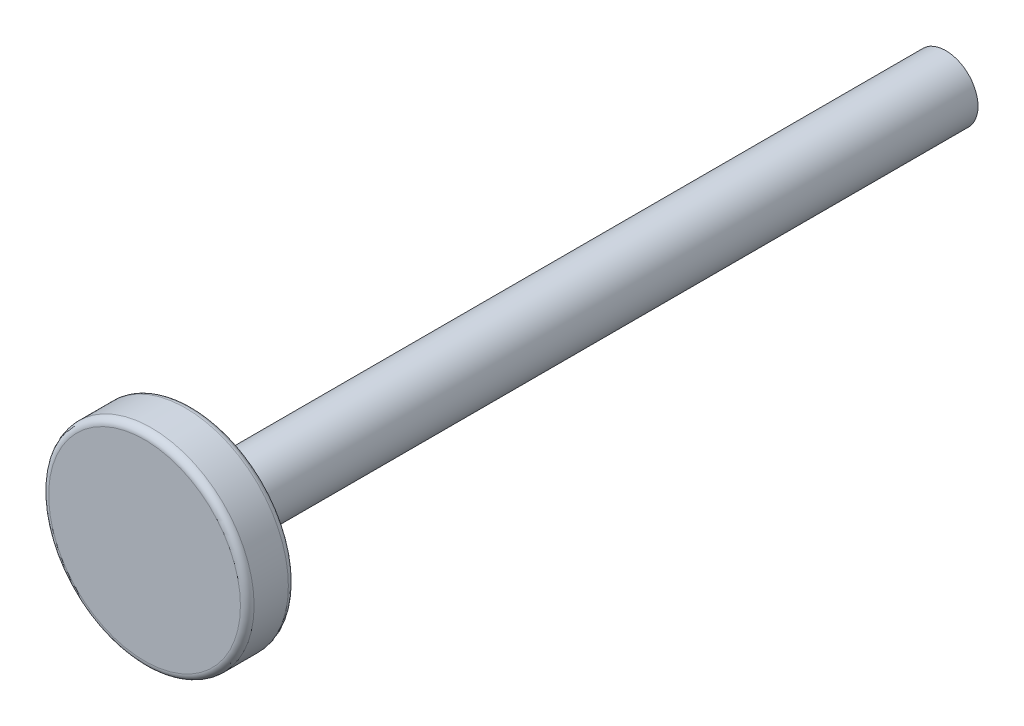
ISO-10303-21;
HEADER;
FILE_DESCRIPTION(('STEP AP214'),'2;1');
FILE_NAME('part.step','',(''),(''),'','','');
FILE_SCHEMA(('AUTOMOTIVE_DESIGN { 1 0 10303 214 1 1 1 1 }'));
ENDSEC;
DATA;
#1=APPLICATION_CONTEXT('core data for automotive mechanical design processes');
#2=APPLICATION_PROTOCOL_DEFINITION('international standard','automotive_design',2000,#1);
#3=PRODUCT_CONTEXT('',#1,'mechanical');
#4=PRODUCT('Part','Part','',(#3));
#5=PRODUCT_RELATED_PRODUCT_CATEGORY('part','',(#4));
#6=PRODUCT_DEFINITION_FORMATION('','',#4);
#7=PRODUCT_DEFINITION_CONTEXT('part definition',#1,'design');
#8=PRODUCT_DEFINITION('design','',#6,#7);
#9=PRODUCT_DEFINITION_SHAPE('','',#8);
#10=(LENGTH_UNIT() NAMED_UNIT(*) SI_UNIT(.MILLI.,.METRE.));
#11=(NAMED_UNIT(*) PLANE_ANGLE_UNIT() SI_UNIT($,.RADIAN.));
#12=(NAMED_UNIT(*) SI_UNIT($,.STERADIAN.) SOLID_ANGLE_UNIT());
#13=UNCERTAINTY_MEASURE_WITH_UNIT(LENGTH_MEASURE(1.E-05),#10,'distance_accuracy_value','');
#14=(GEOMETRIC_REPRESENTATION_CONTEXT(3) GLOBAL_UNCERTAINTY_ASSIGNED_CONTEXT((#13)) GLOBAL_UNIT_ASSIGNED_CONTEXT((#10,
#11,#12)) REPRESENTATION_CONTEXT('',''));
#15=CARTESIAN_POINT('',(0.,0.,0.));
#16=DIRECTION('',(0.,0.,1.));
#17=DIRECTION('',(1.,0.,0.));
#18=AXIS2_PLACEMENT_3D('',#15,#16,#17);
#19=CARTESIAN_POINT('',(-105.393983783825,23.9699999999999,62.4325344745578));
#20=DIRECTION('',(0.,0.,-1.));
#21=DIRECTION('',(-1.,0.,0.));
#22=AXIS2_PLACEMENT_3D('',#19,#20,#21);
#23=CYLINDRICAL_SURFACE('',#22,2.35);
#24=CARTESIAN_POINT('',(-105.393983783825,23.9699999999999,61.9325344745578));
#25=DIRECTION('',(0.,0.,1.));
#26=DIRECTION('',(1.,0.,0.));
#27=AXIS2_PLACEMENT_3D('',#24,#25,#26);
#28=CIRCLE('',#27,2.35);
#29=CARTESIAN_POINT('',(-103.043983783825,23.9699999999999,61.9325344745578));
#30=VERTEX_POINT('',#29);
#31=EDGE_CURVE('E11',#30,#30,#28,.F.);
#32=ORIENTED_EDGE('',*,*,#31,.T.);
#33=EDGE_LOOP('',(#32));
#34=FACE_BOUND('',#33,.T.);
#35=CARTESIAN_POINT('',(-105.393983783825,23.9699999999999,7.43253447455783));
#36=DIRECTION('',(0.,0.,1.));
#37=DIRECTION('',(1.,0.,0.));
#38=AXIS2_PLACEMENT_3D('',#35,#36,#37);
#39=CIRCLE('',#38,2.35);
#40=CARTESIAN_POINT('',(-103.043983783825,23.9699999999999,7.43253447455783));
#41=VERTEX_POINT('',#40);
#42=EDGE_CURVE('E66',#41,#41,#39,.T.);
#43=ORIENTED_EDGE('',*,*,#42,.T.);
#44=EDGE_LOOP('',(#43));
#45=FACE_BOUND('',#44,.T.);
#46=ADVANCED_FACE('F47',(#34,#45),#23,.T.);
#47=CARTESIAN_POINT('',(-105.393983783825,23.9699999999999,7.43253447455783));
#48=DIRECTION('',(0.,0.,1.));
#49=DIRECTION('',(1.,0.,0.));
#50=AXIS2_PLACEMENT_3D('',#47,#48,#49);
#51=PLANE('',#50);
#52=CARTESIAN_POINT('',(-105.393983783825,23.9699999999999,7.43253447455783));
#53=DIRECTION('',(0.,0.,-1.));
#54=DIRECTION('',(-1.,0.,0.));
#55=AXIS2_PLACEMENT_3D('',#52,#53,#54);
#56=CIRCLE('',#55,1.525);
#57=CARTESIAN_POINT('',(-106.918983783825,23.9699999999999,7.43253447455783));
#58=VERTEX_POINT('',#57);
#59=EDGE_CURVE('E73',#58,#58,#56,.T.);
#60=ORIENTED_EDGE('',*,*,#59,.F.);
#61=EDGE_LOOP('',(#60));
#62=FACE_BOUND('',#61,.T.);
#63=ORIENTED_EDGE('',*,*,#42,.F.);
#64=EDGE_LOOP('',(#63));
#65=FACE_BOUND('',#64,.T.);
#66=ADVANCED_FACE('F102',(#62,#65),#51,.F.);
#67=CARTESIAN_POINT('',(-105.393983783825,23.9699999999999,65.9325344745578));
#68=DIRECTION('',(0.,0.,-1.));
#69=DIRECTION('',(-1.,0.,0.));
#70=AXIS2_PLACEMENT_3D('',#67,#68,#69);
#71=CYLINDRICAL_SURFACE('',#70,7.5);
#72=CARTESIAN_POINT('',(-105.393983783825,23.9699999999999,65.4325344745578));
#73=DIRECTION('',(0.,0.,1.));
#74=DIRECTION('',(1.,0.,0.));
#75=AXIS2_PLACEMENT_3D('',#72,#73,#74);
#76=CIRCLE('',#75,7.5);
#77=CARTESIAN_POINT('',(-97.8939837838252,23.9699999999999,65.4325344745578));
#78=VERTEX_POINT('',#77);
#79=EDGE_CURVE('E82',#78,#78,#76,.F.);
#80=ORIENTED_EDGE('',*,*,#79,.T.);
#81=EDGE_LOOP('',(#80));
#82=FACE_BOUND('',#81,.T.);
#83=CARTESIAN_POINT('',(-105.393983783825,23.9699999999999,62.9325344745578));
#84=DIRECTION('',(0.,0.,1.));
#85=DIRECTION('',(1.,0.,0.));
#86=AXIS2_PLACEMENT_3D('',#83,#84,#85);
#87=CIRCLE('',#86,7.5);
#88=CARTESIAN_POINT('',(-97.8939837838252,23.9699999999999,62.9325344745578));
#89=VERTEX_POINT('',#88);
#90=EDGE_CURVE('E79',#89,#89,#87,.T.);
#91=ORIENTED_EDGE('',*,*,#90,.T.);
#92=EDGE_LOOP('',(#91));
#93=FACE_BOUND('',#92,.T.);
#94=ADVANCED_FACE('F99',(#82,#93),#71,.T.);
#95=CARTESIAN_POINT('',(-105.393983783825,23.9699999999999,65.9325344745578));
#96=DIRECTION('',(0.,0.,1.));
#97=DIRECTION('',(1.,0.,0.));
#98=AXIS2_PLACEMENT_3D('',#95,#96,#97);
#99=PLANE('',#98);
#100=CARTESIAN_POINT('',(-105.393983783825,23.9699999999999,65.9325344745578));
#101=DIRECTION('',(0.,0.,1.));
#102=DIRECTION('',(1.,0.,0.));
#103=AXIS2_PLACEMENT_3D('',#100,#101,#102);
#104=CIRCLE('',#103,7.);
#105=CARTESIAN_POINT('',(-98.3939837838252,23.9699999999999,65.9325344745578));
#106=VERTEX_POINT('',#105);
#107=EDGE_CURVE('E70',#106,#106,#104,.T.);
#108=ORIENTED_EDGE('',*,*,#107,.T.);
#109=EDGE_LOOP('',(#108));
#110=FACE_BOUND('',#109,.T.);
#111=ADVANCED_FACE('F101',(#110),#99,.T.);
#112=CARTESIAN_POINT('',(-105.393983783825,23.9699999999999,62.4325344745578));
#113=DIRECTION('',(0.,0.,1.));
#114=DIRECTION('',(1.,0.,0.));
#115=AXIS2_PLACEMENT_3D('',#112,#113,#114);
#116=PLANE('',#115);
#117=CARTESIAN_POINT('',(-105.393983783825,23.9699999999999,62.4325344745578));
#118=DIRECTION('',(0.,0.,1.));
#119=DIRECTION('',(1.,0.,0.));
#120=AXIS2_PLACEMENT_3D('',#117,#118,#119);
#121=CIRCLE('',#120,7.);
#122=CARTESIAN_POINT('',(-98.3939837838252,23.9699999999999,62.4325344745578));
#123=VERTEX_POINT('',#122);
#124=EDGE_CURVE('E54',#123,#123,#121,.F.);
#125=ORIENTED_EDGE('',*,*,#124,.T.);
#126=EDGE_LOOP('',(#125));
#127=FACE_BOUND('',#126,.T.);
#128=CARTESIAN_POINT('',(-105.393983783825,23.9699999999999,62.4325344745578));
#129=DIRECTION('',(0.,0.,1.));
#130=DIRECTION('',(1.,0.,0.));
#131=AXIS2_PLACEMENT_3D('',#128,#129,#130);
#132=CIRCLE('',#131,2.85);
#133=CARTESIAN_POINT('',(-102.543983783825,23.9699999999999,62.4325344745578));
#134=VERTEX_POINT('',#133);
#135=EDGE_CURVE('E85',#134,#134,#132,.T.);
#136=ORIENTED_EDGE('',*,*,#135,.T.);
#137=EDGE_LOOP('',(#136));
#138=FACE_BOUND('',#137,.T.);
#139=ADVANCED_FACE('F90',(#127,#138),#116,.F.);
#140=CARTESIAN_POINT('',(-105.393983783825,23.9699999999999,65.4325344745578));
#141=DIRECTION('',(0.,0.,1.));
#142=DIRECTION('',(1.,0.,0.));
#143=AXIS2_PLACEMENT_3D('',#140,#141,#142);
#144=TOROIDAL_SURFACE('',#143,7.,0.5);
#145=ORIENTED_EDGE('',*,*,#79,.F.);
#146=EDGE_LOOP('',(#145));
#147=FACE_BOUND('',#146,.T.);
#148=ORIENTED_EDGE('',*,*,#107,.F.);
#149=EDGE_LOOP('',(#148));
#150=FACE_BOUND('',#149,.T.);
#151=ADVANCED_FACE('F96',(#147,#150),#144,.T.);
#152=CARTESIAN_POINT('',(-105.393983783825,23.9699999999999,62.9325344745578));
#153=DIRECTION('',(0.,0.,1.));
#154=DIRECTION('',(1.,0.,0.));
#155=AXIS2_PLACEMENT_3D('',#152,#153,#154);
#156=TOROIDAL_SURFACE('',#155,7.,0.5);
#157=ORIENTED_EDGE('',*,*,#124,.F.);
#158=EDGE_LOOP('',(#157));
#159=FACE_BOUND('',#158,.T.);
#160=ORIENTED_EDGE('',*,*,#90,.F.);
#161=EDGE_LOOP('',(#160));
#162=FACE_BOUND('',#161,.T.);
#163=ADVANCED_FACE('F93',(#159,#162),#156,.T.);
#164=CARTESIAN_POINT('',(-105.393983783825,23.9699999999999,61.9325344745578));
#165=DIRECTION('',(0.,0.,1.));
#166=DIRECTION('',(1.,0.,0.));
#167=AXIS2_PLACEMENT_3D('',#164,#165,#166);
#168=TOROIDAL_SURFACE('',#167,2.85,0.5);
#169=ORIENTED_EDGE('',*,*,#31,.F.);
#170=EDGE_LOOP('',(#169));
#171=FACE_BOUND('',#170,.T.);
#172=ORIENTED_EDGE('',*,*,#135,.F.);
#173=EDGE_LOOP('',(#172));
#174=FACE_BOUND('',#173,.T.);
#175=ADVANCED_FACE('F49',(#171,#174),#168,.F.);
#176=CARTESIAN_POINT('',(-105.393983783825,23.9699999999999,27.4325344745578));
#177=DIRECTION('',(0.,0.,-1.));
#178=DIRECTION('',(-1.,0.,0.));
#179=AXIS2_PLACEMENT_3D('',#176,#177,#178);
#180=CONICAL_SURFACE('',#179,1.25,1.02974425867666);
#181=CARTESIAN_POINT('',(-105.393983783825,23.9699999999999,28.1836102483423));
#182=VERTEX_POINT('',#181);
#183=VERTEX_LOOP('',#182);
#184=FACE_BOUND('',#183,.T.);
#185=CARTESIAN_POINT('',(-105.393983783825,23.9699999999999,27.4325344745578));
#186=DIRECTION('',(0.,0.,-1.));
#187=DIRECTION('',(-1.,0.,0.));
#188=AXIS2_PLACEMENT_3D('',#185,#186,#187);
#189=CIRCLE('',#188,1.25);
#190=CARTESIAN_POINT('',(-106.643983783825,23.9699999999999,27.4325344745578));
#191=VERTEX_POINT('',#190);
#192=EDGE_CURVE('E64',#191,#191,#189,.T.);
#193=ORIENTED_EDGE('',*,*,#192,.T.);
#194=EDGE_LOOP('',(#193));
#195=FACE_BOUND('',#194,.T.);
#196=ADVANCED_FACE('F57',(#184,#195),#180,.F.);
#197=CARTESIAN_POINT('',(-105.393983783825,23.9699999999999,7.43253447455783));
#198=DIRECTION('',(0.,0.,-1.));
#199=DIRECTION('',(-1.,0.,0.));
#200=AXIS2_PLACEMENT_3D('',#197,#198,#199);
#201=CYLINDRICAL_SURFACE('',#200,1.25);
#202=ORIENTED_EDGE('',*,*,#192,.F.);
#203=EDGE_LOOP('',(#202));
#204=FACE_BOUND('',#203,.T.);
#205=CARTESIAN_POINT('',(-105.393983783825,23.9699999999999,7.70753447455783));
#206=DIRECTION('',(0.,0.,-1.));
#207=DIRECTION('',(-1.,0.,0.));
#208=AXIS2_PLACEMENT_3D('',#205,#206,#207);
#209=CIRCLE('',#208,1.25);
#210=CARTESIAN_POINT('',(-106.643983783825,23.9699999999999,7.70753447455783));
#211=VERTEX_POINT('',#210);
#212=EDGE_CURVE('E67',#211,#211,#209,.T.);
#213=ORIENTED_EDGE('',*,*,#212,.T.);
#214=EDGE_LOOP('',(#213));
#215=FACE_BOUND('',#214,.T.);
#216=ADVANCED_FACE('F60',(#204,#215),#201,.F.);
#217=CARTESIAN_POINT('',(-105.393983783825,23.9699999999999,7.43253447455783));
#218=DIRECTION('',(0.,0.,-1.));
#219=DIRECTION('',(-1.,0.,0.));
#220=AXIS2_PLACEMENT_3D('',#217,#218,#219);
#221=CONICAL_SURFACE('',#220,1.525,0.785398163397442);
#222=ORIENTED_EDGE('',*,*,#212,.F.);
#223=EDGE_LOOP('',(#222));
#224=FACE_BOUND('',#223,.T.);
#225=ORIENTED_EDGE('',*,*,#59,.T.);
#226=EDGE_LOOP('',(#225));
#227=FACE_BOUND('',#226,.T.);
#228=ADVANCED_FACE('F134',(#224,#227),#221,.F.);
#229=CLOSED_SHELL('',(#46,#66,#94,#111,#139,#151,#163,#175,#196,#216,#228));
#230=MANIFOLD_SOLID_BREP('B2',#229);
#231=ADVANCED_BREP_SHAPE_REPRESENTATION('',(#18,#230),#14);
#232=SHAPE_DEFINITION_REPRESENTATION(#9,#231);
ENDSEC;
END-ISO-10303-21;
